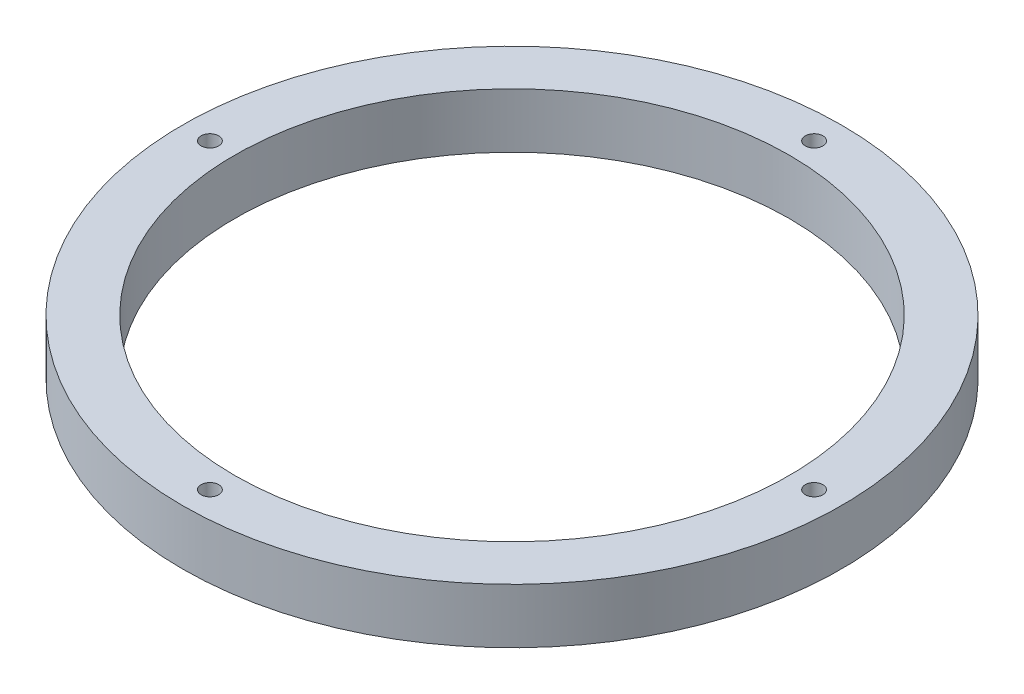
ISO-10303-21;
HEADER;
FILE_DESCRIPTION(('STEP AP214'),'2;1');
FILE_NAME('part.step','',(''),(''),'','','');
FILE_SCHEMA(('AUTOMOTIVE_DESIGN { 1 0 10303 214 1 1 1 1 }'));
ENDSEC;
DATA;
#1=APPLICATION_CONTEXT('core data for automotive mechanical design processes');
#2=APPLICATION_PROTOCOL_DEFINITION('international standard','automotive_design',2000,#1);
#3=PRODUCT_CONTEXT('',#1,'mechanical');
#4=PRODUCT('Part','Part','',(#3));
#5=PRODUCT_RELATED_PRODUCT_CATEGORY('part','',(#4));
#6=PRODUCT_DEFINITION_FORMATION('','',#4);
#7=PRODUCT_DEFINITION_CONTEXT('part definition',#1,'design');
#8=PRODUCT_DEFINITION('design','',#6,#7);
#9=PRODUCT_DEFINITION_SHAPE('','',#8);
#10=(LENGTH_UNIT() NAMED_UNIT(*) SI_UNIT(.MILLI.,.METRE.));
#11=(NAMED_UNIT(*) PLANE_ANGLE_UNIT() SI_UNIT($,.RADIAN.));
#12=(NAMED_UNIT(*) SI_UNIT($,.STERADIAN.) SOLID_ANGLE_UNIT());
#13=UNCERTAINTY_MEASURE_WITH_UNIT(LENGTH_MEASURE(1.E-05),#10,'distance_accuracy_value','');
#14=(GEOMETRIC_REPRESENTATION_CONTEXT(3) GLOBAL_UNCERTAINTY_ASSIGNED_CONTEXT((#13)) GLOBAL_UNIT_ASSIGNED_CONTEXT((#10,
#11,#12)) REPRESENTATION_CONTEXT('',''));
#15=CARTESIAN_POINT('',(0.,0.,0.));
#16=DIRECTION('',(0.,0.,1.));
#17=DIRECTION('',(1.,0.,0.));
#18=AXIS2_PLACEMENT_3D('',#15,#16,#17);
#19=CARTESIAN_POINT('',(0.,10.,0.));
#20=DIRECTION('',(0.,1.,0.));
#21=DIRECTION('',(0.,0.,1.));
#22=AXIS2_PLACEMENT_3D('',#19,#20,#21);
#23=PLANE('',#22);
#24=CARTESIAN_POINT('',(3.10618136515851E-12,10.,55.));
#25=DIRECTION('',(0.,1.,0.));
#26=DIRECTION('',(0.,0.,1.));
#27=AXIS2_PLACEMENT_3D('',#24,#25,#26);
#28=CIRCLE('',#27,1.60000000000334);
#29=CARTESIAN_POINT('',(3.10618136515851E-12,10.,56.6000000000033));
#30=VERTEX_POINT('',#29);
#31=EDGE_CURVE('E61',#30,#30,#28,.T.);
#32=ORIENTED_EDGE('',*,*,#31,.F.);
#33=EDGE_LOOP('',(#32));
#34=FACE_BOUND('',#33,.T.);
#35=CARTESIAN_POINT('',(0.,10.,-55.));
#36=DIRECTION('',(0.,1.,0.));
#37=DIRECTION('',(0.,0.,1.));
#38=AXIS2_PLACEMENT_3D('',#35,#36,#37);
#39=CIRCLE('',#38,1.6);
#40=CARTESIAN_POINT('',(0.,10.,-53.4));
#41=VERTEX_POINT('',#40);
#42=EDGE_CURVE('E49',#41,#41,#39,.T.);
#43=ORIENTED_EDGE('',*,*,#42,.F.);
#44=EDGE_LOOP('',(#43));
#45=FACE_BOUND('',#44,.T.);
#46=CARTESIAN_POINT('',(0.,10.,0.));
#47=DIRECTION('',(0.,1.,0.));
#48=DIRECTION('',(0.,0.,1.));
#49=AXIS2_PLACEMENT_3D('',#46,#47,#48);
#50=CIRCLE('',#49,60.);
#51=CARTESIAN_POINT('',(0.,10.,60.));
#52=VERTEX_POINT('',#51);
#53=EDGE_CURVE('E10',#52,#52,#50,.T.);
#54=ORIENTED_EDGE('',*,*,#53,.T.);
#55=EDGE_LOOP('',(#54));
#56=FACE_BOUND('',#55,.T.);
#57=CARTESIAN_POINT('',(0.,10.,0.));
#58=DIRECTION('',(0.,1.,0.));
#59=DIRECTION('',(0.,0.,1.));
#60=AXIS2_PLACEMENT_3D('',#57,#58,#59);
#61=CIRCLE('',#60,50.5);
#62=CARTESIAN_POINT('',(0.,10.,50.5));
#63=VERTEX_POINT('',#62);
#64=EDGE_CURVE('E44',#63,#63,#61,.T.);
#65=ORIENTED_EDGE('',*,*,#64,.F.);
#66=EDGE_LOOP('',(#65));
#67=FACE_BOUND('',#66,.T.);
#68=CARTESIAN_POINT('',(55.0000000000016,10.,-1.55309068257925E-12));
#69=DIRECTION('',(0.,1.,0.));
#70=DIRECTION('',(0.,0.,1.));
#71=AXIS2_PLACEMENT_3D('',#68,#69,#70);
#72=CIRCLE('',#71,1.60000000000121);
#73=CARTESIAN_POINT('',(55.0000000000016,10.,1.59999999999966));
#74=VERTEX_POINT('',#73);
#75=EDGE_CURVE('E55',#74,#74,#72,.T.);
#76=ORIENTED_EDGE('',*,*,#75,.F.);
#77=EDGE_LOOP('',(#76));
#78=FACE_BOUND('',#77,.T.);
#79=CARTESIAN_POINT('',(-54.9999999999985,10.,1.55982623997457E-12));
#80=DIRECTION('',(0.,1.,0.));
#81=DIRECTION('',(0.,0.,1.));
#82=AXIS2_PLACEMENT_3D('',#79,#80,#81);
#83=CIRCLE('',#82,1.60000000000249);
#84=CARTESIAN_POINT('',(-54.9999999999985,10.,1.60000000000405));
#85=VERTEX_POINT('',#84);
#86=EDGE_CURVE('E67',#85,#85,#83,.T.);
#87=ORIENTED_EDGE('',*,*,#86,.F.);
#88=EDGE_LOOP('',(#87));
#89=FACE_BOUND('',#88,.T.);
#90=ADVANCED_FACE('F33',(#34,#45,#56,#67,#78,#89),#23,.T.);
#91=CARTESIAN_POINT('',(0.,0.,0.));
#92=DIRECTION('',(0.,1.,0.));
#93=DIRECTION('',(0.,0.,1.));
#94=AXIS2_PLACEMENT_3D('',#91,#92,#93);
#95=PLANE('',#94);
#96=CARTESIAN_POINT('',(0.,0.,0.));
#97=DIRECTION('',(0.,1.,0.));
#98=DIRECTION('',(0.,0.,1.));
#99=AXIS2_PLACEMENT_3D('',#96,#97,#98);
#100=CIRCLE('',#99,60.);
#101=CARTESIAN_POINT('',(0.,0.,60.));
#102=VERTEX_POINT('',#101);
#103=EDGE_CURVE('E37',#102,#102,#100,.T.);
#104=ORIENTED_EDGE('',*,*,#103,.F.);
#105=EDGE_LOOP('',(#104));
#106=FACE_BOUND('',#105,.T.);
#107=CARTESIAN_POINT('',(0.,0.,0.));
#108=DIRECTION('',(0.,1.,0.));
#109=DIRECTION('',(0.,0.,1.));
#110=AXIS2_PLACEMENT_3D('',#107,#108,#109);
#111=CIRCLE('',#110,50.5);
#112=CARTESIAN_POINT('',(0.,0.,50.5));
#113=VERTEX_POINT('',#112);
#114=EDGE_CURVE('E46',#113,#113,#111,.T.);
#115=ORIENTED_EDGE('',*,*,#114,.T.);
#116=EDGE_LOOP('',(#115));
#117=FACE_BOUND('',#116,.T.);
#118=CARTESIAN_POINT('',(0.,0.,-55.));
#119=DIRECTION('',(0.,1.,0.));
#120=DIRECTION('',(0.,0.,1.));
#121=AXIS2_PLACEMENT_3D('',#118,#119,#120);
#122=CIRCLE('',#121,1.6);
#123=CARTESIAN_POINT('',(0.,0.,-53.4));
#124=VERTEX_POINT('',#123);
#125=EDGE_CURVE('E52',#124,#124,#122,.T.);
#126=ORIENTED_EDGE('',*,*,#125,.T.);
#127=EDGE_LOOP('',(#126));
#128=FACE_BOUND('',#127,.T.);
#129=CARTESIAN_POINT('',(55.0000000000016,0.,-1.55309068257925E-12));
#130=DIRECTION('',(0.,1.,0.));
#131=DIRECTION('',(0.,0.,1.));
#132=AXIS2_PLACEMENT_3D('',#129,#130,#131);
#133=CIRCLE('',#132,1.60000000000121);
#134=CARTESIAN_POINT('',(55.0000000000016,0.,1.59999999999966));
#135=VERTEX_POINT('',#134);
#136=EDGE_CURVE('E58',#135,#135,#133,.T.);
#137=ORIENTED_EDGE('',*,*,#136,.T.);
#138=EDGE_LOOP('',(#137));
#139=FACE_BOUND('',#138,.T.);
#140=CARTESIAN_POINT('',(3.10618136515851E-12,0.,55.));
#141=DIRECTION('',(0.,1.,0.));
#142=DIRECTION('',(0.,0.,1.));
#143=AXIS2_PLACEMENT_3D('',#140,#141,#142);
#144=CIRCLE('',#143,1.60000000000334);
#145=CARTESIAN_POINT('',(3.10618136515851E-12,0.,56.6000000000033));
#146=VERTEX_POINT('',#145);
#147=EDGE_CURVE('E64',#146,#146,#144,.T.);
#148=ORIENTED_EDGE('',*,*,#147,.T.);
#149=EDGE_LOOP('',(#148));
#150=FACE_BOUND('',#149,.T.);
#151=CARTESIAN_POINT('',(-54.9999999999985,0.,1.55982623997457E-12));
#152=DIRECTION('',(0.,1.,0.));
#153=DIRECTION('',(0.,0.,1.));
#154=AXIS2_PLACEMENT_3D('',#151,#152,#153);
#155=CIRCLE('',#154,1.60000000000249);
#156=CARTESIAN_POINT('',(-54.9999999999985,0.,1.60000000000405));
#157=VERTEX_POINT('',#156);
#158=EDGE_CURVE('E70',#157,#157,#155,.T.);
#159=ORIENTED_EDGE('',*,*,#158,.T.);
#160=EDGE_LOOP('',(#159));
#161=FACE_BOUND('',#160,.T.);
#162=ADVANCED_FACE('F80',(#106,#117,#128,#139,#150,#161),#95,.F.);
#163=CARTESIAN_POINT('',(0.,10.,0.));
#164=DIRECTION('',(0.,-1.,0.));
#165=DIRECTION('',(0.,0.,-1.));
#166=AXIS2_PLACEMENT_3D('',#163,#164,#165);
#167=CYLINDRICAL_SURFACE('',#166,60.);
#168=ORIENTED_EDGE('',*,*,#53,.F.);
#169=EDGE_LOOP('',(#168));
#170=FACE_BOUND('',#169,.T.);
#171=ORIENTED_EDGE('',*,*,#103,.T.);
#172=EDGE_LOOP('',(#171));
#173=FACE_BOUND('',#172,.T.);
#174=ADVANCED_FACE('F35',(#170,#173),#167,.T.);
#175=CARTESIAN_POINT('',(0.,10.,0.));
#176=DIRECTION('',(0.,-1.,0.));
#177=DIRECTION('',(0.,0.,-1.));
#178=AXIS2_PLACEMENT_3D('',#175,#176,#177);
#179=CYLINDRICAL_SURFACE('',#178,50.5);
#180=ORIENTED_EDGE('',*,*,#64,.T.);
#181=EDGE_LOOP('',(#180));
#182=FACE_BOUND('',#181,.T.);
#183=ORIENTED_EDGE('',*,*,#114,.F.);
#184=EDGE_LOOP('',(#183));
#185=FACE_BOUND('',#184,.T.);
#186=ADVANCED_FACE('F90',(#182,#185),#179,.F.);
#187=CARTESIAN_POINT('',(0.,10.,-55.));
#188=DIRECTION('',(0.,-1.,0.));
#189=DIRECTION('',(0.,0.,-1.));
#190=AXIS2_PLACEMENT_3D('',#187,#188,#189);
#191=CYLINDRICAL_SURFACE('',#190,1.6);
#192=ORIENTED_EDGE('',*,*,#42,.T.);
#193=EDGE_LOOP('',(#192));
#194=FACE_BOUND('',#193,.T.);
#195=ORIENTED_EDGE('',*,*,#125,.F.);
#196=EDGE_LOOP('',(#195));
#197=FACE_BOUND('',#196,.T.);
#198=ADVANCED_FACE('F93',(#194,#197),#191,.F.);
#199=CARTESIAN_POINT('',(55.0000000000016,10.,-1.55309068257925E-12));
#200=DIRECTION('',(0.,-1.,0.));
#201=DIRECTION('',(0.,0.,-1.));
#202=AXIS2_PLACEMENT_3D('',#199,#200,#201);
#203=CYLINDRICAL_SURFACE('',#202,1.60000000000121);
#204=ORIENTED_EDGE('',*,*,#75,.T.);
#205=EDGE_LOOP('',(#204));
#206=FACE_BOUND('',#205,.T.);
#207=ORIENTED_EDGE('',*,*,#136,.F.);
#208=EDGE_LOOP('',(#207));
#209=FACE_BOUND('',#208,.T.);
#210=ADVANCED_FACE('F97',(#206,#209),#203,.F.);
#211=CARTESIAN_POINT('',(3.10618136515851E-12,10.,55.));
#212=DIRECTION('',(0.,-1.,0.));
#213=DIRECTION('',(0.,0.,-1.));
#214=AXIS2_PLACEMENT_3D('',#211,#212,#213);
#215=CYLINDRICAL_SURFACE('',#214,1.60000000000334);
#216=ORIENTED_EDGE('',*,*,#31,.T.);
#217=EDGE_LOOP('',(#216));
#218=FACE_BOUND('',#217,.T.);
#219=ORIENTED_EDGE('',*,*,#147,.F.);
#220=EDGE_LOOP('',(#219));
#221=FACE_BOUND('',#220,.T.);
#222=ADVANCED_FACE('F101',(#218,#221),#215,.F.);
#223=CARTESIAN_POINT('',(-54.9999999999985,10.,1.55982623997457E-12));
#224=DIRECTION('',(0.,-1.,0.));
#225=DIRECTION('',(0.,0.,-1.));
#226=AXIS2_PLACEMENT_3D('',#223,#224,#225);
#227=CYLINDRICAL_SURFACE('',#226,1.60000000000249);
#228=ORIENTED_EDGE('',*,*,#86,.T.);
#229=EDGE_LOOP('',(#228));
#230=FACE_BOUND('',#229,.T.);
#231=ORIENTED_EDGE('',*,*,#158,.F.);
#232=EDGE_LOOP('',(#231));
#233=FACE_BOUND('',#232,.T.);
#234=ADVANCED_FACE('F76',(#230,#233),#227,.F.);
#235=CLOSED_SHELL('',(#90,#162,#174,#186,#198,#210,#222,#234));
#236=MANIFOLD_SOLID_BREP('B2',#235);
#237=ADVANCED_BREP_SHAPE_REPRESENTATION('',(#18,#236),#14);
#238=SHAPE_DEFINITION_REPRESENTATION(#9,#237);
ENDSEC;
END-ISO-10303-21;
